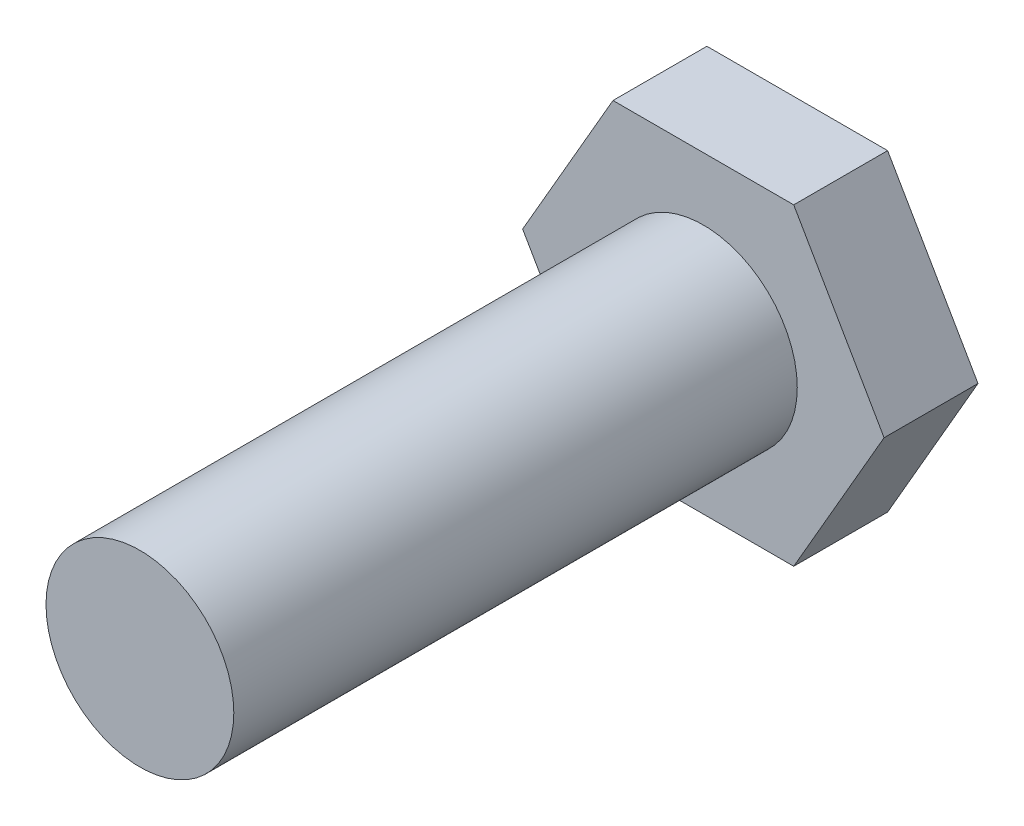
ISO-10303-21;
HEADER;
FILE_DESCRIPTION(('STEP AP214'),'2;1');
FILE_NAME('part.step','',(''),(''),'','','');
FILE_SCHEMA(('AUTOMOTIVE_DESIGN { 1 0 10303 214 1 1 1 1 }'));
ENDSEC;
DATA;
#1=APPLICATION_CONTEXT('core data for automotive mechanical design processes');
#2=APPLICATION_PROTOCOL_DEFINITION('international standard','automotive_design',2000,#1);
#3=PRODUCT_CONTEXT('',#1,'mechanical');
#4=PRODUCT('Part','Part','',(#3));
#5=PRODUCT_RELATED_PRODUCT_CATEGORY('part','',(#4));
#6=PRODUCT_DEFINITION_FORMATION('','',#4);
#7=PRODUCT_DEFINITION_CONTEXT('part definition',#1,'design');
#8=PRODUCT_DEFINITION('design','',#6,#7);
#9=PRODUCT_DEFINITION_SHAPE('','',#8);
#10=(LENGTH_UNIT() NAMED_UNIT(*) SI_UNIT(.MILLI.,.METRE.));
#11=(NAMED_UNIT(*) PLANE_ANGLE_UNIT() SI_UNIT($,.RADIAN.));
#12=(NAMED_UNIT(*) SI_UNIT($,.STERADIAN.) SOLID_ANGLE_UNIT());
#13=UNCERTAINTY_MEASURE_WITH_UNIT(LENGTH_MEASURE(1.E-05),#10,'distance_accuracy_value','');
#14=(GEOMETRIC_REPRESENTATION_CONTEXT(3) GLOBAL_UNCERTAINTY_ASSIGNED_CONTEXT((#13)) GLOBAL_UNIT_ASSIGNED_CONTEXT((#10,
#11,#12)) REPRESENTATION_CONTEXT('',''));
#15=CARTESIAN_POINT('',(0.,0.,0.));
#16=DIRECTION('',(0.,0.,1.));
#17=DIRECTION('',(1.,0.,0.));
#18=AXIS2_PLACEMENT_3D('',#15,#16,#17);
#19=CARTESIAN_POINT('',(0.,0.,1.5));
#20=DIRECTION('',(0.,0.,1.));
#21=DIRECTION('',(1.,0.,0.));
#22=AXIS2_PLACEMENT_3D('',#19,#20,#21);
#23=PLANE('',#22);
#24=DIRECTION('',(0.5,0.866025403784439,0.));
#25=VECTOR('',#24,1.);
#26=CARTESIAN_POINT('',(1.44337567297407,-2.5,1.5));
#27=LINE('',#26,#25);
#28=CARTESIAN_POINT('',(1.44337567297407,-2.5,1.5));
#29=VERTEX_POINT('',#28);
#30=CARTESIAN_POINT('',(2.88675134594813,0.,1.5));
#31=VERTEX_POINT('',#30);
#32=EDGE_CURVE('E128',#29,#31,#27,.T.);
#33=ORIENTED_EDGE('',*,*,#32,.T.);
#34=DIRECTION('',(-0.5,0.866025403784438,0.));
#35=VECTOR('',#34,1.);
#36=CARTESIAN_POINT('',(2.88675134594813,0.,1.5));
#37=LINE('',#36,#35);
#38=CARTESIAN_POINT('',(1.44337567297406,2.5,1.5));
#39=VERTEX_POINT('',#38);
#40=EDGE_CURVE('E86',#31,#39,#37,.T.);
#41=ORIENTED_EDGE('',*,*,#40,.T.);
#42=DIRECTION('',(-1.,0.,0.));
#43=VECTOR('',#42,1.);
#44=CARTESIAN_POINT('',(1.44337567297406,2.5,1.5));
#45=LINE('',#44,#43);
#46=CARTESIAN_POINT('',(-1.44337567297407,2.5,1.5));
#47=VERTEX_POINT('',#46);
#48=EDGE_CURVE('E99',#39,#47,#45,.T.);
#49=ORIENTED_EDGE('',*,*,#48,.T.);
#50=DIRECTION('',(-0.499999999999999,-0.866025403784439,0.));
#51=VECTOR('',#50,1.);
#52=CARTESIAN_POINT('',(-1.44337567297407,2.5,1.5));
#53=LINE('',#52,#51);
#54=CARTESIAN_POINT('',(-2.88675134594813,0.,1.5));
#55=VERTEX_POINT('',#54);
#56=EDGE_CURVE('E93',#47,#55,#53,.T.);
#57=ORIENTED_EDGE('',*,*,#56,.T.);
#58=DIRECTION('',(0.5,-0.866025403784439,0.));
#59=VECTOR('',#58,1.);
#60=CARTESIAN_POINT('',(-2.88675134594813,0.,1.5));
#61=LINE('',#60,#59);
#62=CARTESIAN_POINT('',(-1.44337567297406,-2.5,1.5));
#63=VERTEX_POINT('',#62);
#64=EDGE_CURVE('E97',#55,#63,#61,.T.);
#65=ORIENTED_EDGE('',*,*,#64,.T.);
#66=DIRECTION('',(1.,0.,0.));
#67=VECTOR('',#66,1.);
#68=CARTESIAN_POINT('',(-1.44337567297406,-2.5,1.5));
#69=LINE('',#68,#67);
#70=EDGE_CURVE('E49',#63,#29,#69,.T.);
#71=ORIENTED_EDGE('',*,*,#70,.T.);
#72=EDGE_LOOP('',(#33,#41,#49,#57,#65,#71));
#73=FACE_BOUND('',#72,.T.);
#74=CARTESIAN_POINT('',(0.,0.,1.5));
#75=DIRECTION('',(0.,0.,1.));
#76=DIRECTION('',(1.,0.,0.));
#77=AXIS2_PLACEMENT_3D('',#74,#75,#76);
#78=CIRCLE('',#77,1.5);
#79=CARTESIAN_POINT('',(1.5,0.,1.5));
#80=VERTEX_POINT('',#79);
#81=EDGE_CURVE('E168',#80,#80,#78,.T.);
#82=ORIENTED_EDGE('',*,*,#81,.F.);
#83=EDGE_LOOP('',(#82));
#84=FACE_BOUND('',#83,.T.);
#85=ADVANCED_FACE('F32',(#73,#84),#23,.T.);
#86=CARTESIAN_POINT('',(1.44337567297407,-2.5,1.5));
#87=DIRECTION('',(-0.866025403784439,0.5,0.));
#88=DIRECTION('',(-0.5,-0.866025403784439,0.));
#89=AXIS2_PLACEMENT_3D('',#86,#87,#88);
#90=PLANE('',#89);
#91=DIRECTION('',(0.5,0.866025403784439,0.));
#92=VECTOR('',#91,1.);
#93=CARTESIAN_POINT('',(1.44337567297407,-2.5,0.));
#94=LINE('',#93,#92);
#95=CARTESIAN_POINT('',(1.44337567297407,-2.5,0.));
#96=VERTEX_POINT('',#95);
#97=CARTESIAN_POINT('',(2.88675134594813,0.,0.));
#98=VERTEX_POINT('',#97);
#99=EDGE_CURVE('E117',#96,#98,#94,.T.);
#100=ORIENTED_EDGE('',*,*,#99,.T.);
#101=DIRECTION('',(0.,0.,-1.));
#102=VECTOR('',#101,1.);
#103=CARTESIAN_POINT('',(2.88675134594813,0.,1.5));
#104=LINE('',#103,#102);
#105=EDGE_CURVE('E11',#31,#98,#104,.T.);
#106=ORIENTED_EDGE('',*,*,#105,.F.);
#107=ORIENTED_EDGE('',*,*,#32,.F.);
#108=DIRECTION('',(0.,0.,-1.));
#109=VECTOR('',#108,1.);
#110=CARTESIAN_POINT('',(1.44337567297407,-2.5,1.5));
#111=LINE('',#110,#109);
#112=EDGE_CURVE('E113',#29,#96,#111,.T.);
#113=ORIENTED_EDGE('',*,*,#112,.T.);
#114=EDGE_LOOP('',(#100,#106,#107,#113));
#115=FACE_BOUND('',#114,.T.);
#116=ADVANCED_FACE('F34',(#115),#90,.F.);
#117=CARTESIAN_POINT('',(2.88675134594813,0.,1.5));
#118=DIRECTION('',(-0.866025403784438,-0.5,0.));
#119=DIRECTION('',(0.5,-0.866025403784438,0.));
#120=AXIS2_PLACEMENT_3D('',#117,#118,#119);
#121=PLANE('',#120);
#122=DIRECTION('',(-0.5,0.866025403784438,0.));
#123=VECTOR('',#122,1.);
#124=CARTESIAN_POINT('',(2.88675134594813,0.,0.));
#125=LINE('',#124,#123);
#126=CARTESIAN_POINT('',(1.44337567297406,2.5,0.));
#127=VERTEX_POINT('',#126);
#128=EDGE_CURVE('E120',#98,#127,#125,.T.);
#129=ORIENTED_EDGE('',*,*,#128,.T.);
#130=DIRECTION('',(0.,0.,-1.));
#131=VECTOR('',#130,1.);
#132=CARTESIAN_POINT('',(1.44337567297406,2.5,1.5));
#133=LINE('',#132,#131);
#134=EDGE_CURVE('E41',#39,#127,#133,.T.);
#135=ORIENTED_EDGE('',*,*,#134,.F.);
#136=ORIENTED_EDGE('',*,*,#40,.F.);
#137=ORIENTED_EDGE('',*,*,#105,.T.);
#138=EDGE_LOOP('',(#129,#135,#136,#137));
#139=FACE_BOUND('',#138,.T.);
#140=ADVANCED_FACE('F156',(#139),#121,.F.);
#141=CARTESIAN_POINT('',(1.44337567297406,2.5,1.5));
#142=DIRECTION('',(0.,-1.,0.));
#143=DIRECTION('',(1.,0.,0.));
#144=AXIS2_PLACEMENT_3D('',#141,#142,#143);
#145=PLANE('',#144);
#146=DIRECTION('',(-1.,0.,0.));
#147=VECTOR('',#146,1.);
#148=CARTESIAN_POINT('',(1.44337567297406,2.5,0.));
#149=LINE('',#148,#147);
#150=CARTESIAN_POINT('',(-1.44337567297407,2.5,0.));
#151=VERTEX_POINT('',#150);
#152=EDGE_CURVE('E123',#127,#151,#149,.T.);
#153=ORIENTED_EDGE('',*,*,#152,.T.);
#154=DIRECTION('',(0.,0.,-1.));
#155=VECTOR('',#154,1.);
#156=CARTESIAN_POINT('',(-1.44337567297407,2.5,1.5));
#157=LINE('',#156,#155);
#158=EDGE_CURVE('E108',#47,#151,#157,.T.);
#159=ORIENTED_EDGE('',*,*,#158,.F.);
#160=ORIENTED_EDGE('',*,*,#48,.F.);
#161=ORIENTED_EDGE('',*,*,#134,.T.);
#162=EDGE_LOOP('',(#153,#159,#160,#161));
#163=FACE_BOUND('',#162,.T.);
#164=ADVANCED_FACE('F134',(#163),#145,.F.);
#165=CARTESIAN_POINT('',(-1.44337567297407,2.5,1.5));
#166=DIRECTION('',(0.866025403784439,-0.499999999999999,0.));
#167=DIRECTION('',(0.499999999999999,0.866025403784439,0.));
#168=AXIS2_PLACEMENT_3D('',#165,#166,#167);
#169=PLANE('',#168);
#170=DIRECTION('',(-0.499999999999999,-0.866025403784439,0.));
#171=VECTOR('',#170,1.);
#172=CARTESIAN_POINT('',(-1.44337567297407,2.5,0.));
#173=LINE('',#172,#171);
#174=CARTESIAN_POINT('',(-2.88675134594813,0.,0.));
#175=VERTEX_POINT('',#174);
#176=EDGE_CURVE('E107',#151,#175,#173,.T.);
#177=ORIENTED_EDGE('',*,*,#176,.T.);
#178=DIRECTION('',(0.,0.,-1.));
#179=VECTOR('',#178,1.);
#180=CARTESIAN_POINT('',(-2.88675134594813,0.,1.5));
#181=LINE('',#180,#179);
#182=EDGE_CURVE('E104',#55,#175,#181,.T.);
#183=ORIENTED_EDGE('',*,*,#182,.F.);
#184=ORIENTED_EDGE('',*,*,#56,.F.);
#185=ORIENTED_EDGE('',*,*,#158,.T.);
#186=EDGE_LOOP('',(#177,#183,#184,#185));
#187=FACE_BOUND('',#186,.T.);
#188=ADVANCED_FACE('F105',(#187),#169,.F.);
#189=CARTESIAN_POINT('',(-2.88675134594813,0.,1.5));
#190=DIRECTION('',(0.866025403784438,0.5,0.));
#191=DIRECTION('',(-0.5,0.866025403784439,0.));
#192=AXIS2_PLACEMENT_3D('',#189,#190,#191);
#193=PLANE('',#192);
#194=DIRECTION('',(0.5,-0.866025403784439,0.));
#195=VECTOR('',#194,1.);
#196=CARTESIAN_POINT('',(-2.88675134594813,0.,0.));
#197=LINE('',#196,#195);
#198=CARTESIAN_POINT('',(-1.44337567297406,-2.5,0.));
#199=VERTEX_POINT('',#198);
#200=EDGE_CURVE('E72',#175,#199,#197,.T.);
#201=ORIENTED_EDGE('',*,*,#200,.T.);
#202=DIRECTION('',(0.,0.,-1.));
#203=VECTOR('',#202,1.);
#204=CARTESIAN_POINT('',(-1.44337567297406,-2.5,1.5));
#205=LINE('',#204,#203);
#206=EDGE_CURVE('E109',#63,#199,#205,.T.);
#207=ORIENTED_EDGE('',*,*,#206,.F.);
#208=ORIENTED_EDGE('',*,*,#64,.F.);
#209=ORIENTED_EDGE('',*,*,#182,.T.);
#210=EDGE_LOOP('',(#201,#207,#208,#209));
#211=FACE_BOUND('',#210,.T.);
#212=ADVANCED_FACE('F111',(#211),#193,.F.);
#213=CARTESIAN_POINT('',(-1.44337567297406,-2.5,1.5));
#214=DIRECTION('',(0.,1.,0.));
#215=DIRECTION('',(-1.,0.,0.));
#216=AXIS2_PLACEMENT_3D('',#213,#214,#215);
#217=PLANE('',#216);
#218=DIRECTION('',(1.,0.,0.));
#219=VECTOR('',#218,1.);
#220=CARTESIAN_POINT('',(-1.44337567297406,-2.5,0.));
#221=LINE('',#220,#219);
#222=EDGE_CURVE('E78',#199,#96,#221,.T.);
#223=ORIENTED_EDGE('',*,*,#222,.T.);
#224=ORIENTED_EDGE('',*,*,#112,.F.);
#225=ORIENTED_EDGE('',*,*,#70,.F.);
#226=ORIENTED_EDGE('',*,*,#206,.T.);
#227=EDGE_LOOP('',(#223,#224,#225,#226));
#228=FACE_BOUND('',#227,.T.);
#229=ADVANCED_FACE('F141',(#228),#217,.F.);
#230=CARTESIAN_POINT('',(0.,0.,0.));
#231=DIRECTION('',(0.,0.,1.));
#232=DIRECTION('',(1.,0.,0.));
#233=AXIS2_PLACEMENT_3D('',#230,#231,#232);
#234=PLANE('',#233);
#235=ORIENTED_EDGE('',*,*,#99,.F.);
#236=ORIENTED_EDGE('',*,*,#222,.F.);
#237=ORIENTED_EDGE('',*,*,#200,.F.);
#238=ORIENTED_EDGE('',*,*,#176,.F.);
#239=ORIENTED_EDGE('',*,*,#152,.F.);
#240=ORIENTED_EDGE('',*,*,#128,.F.);
#241=EDGE_LOOP('',(#235,#236,#237,#238,#239,#240));
#242=FACE_BOUND('',#241,.T.);
#243=ADVANCED_FACE('F137',(#242),#234,.F.);
#244=CARTESIAN_POINT('',(0.,0.,10.5));
#245=DIRECTION('',(0.,0.,-1.));
#246=DIRECTION('',(-1.,0.,0.));
#247=AXIS2_PLACEMENT_3D('',#244,#245,#246);
#248=CYLINDRICAL_SURFACE('',#247,1.5);
#249=CARTESIAN_POINT('',(0.,0.,10.5));
#250=DIRECTION('',(0.,0.,1.));
#251=DIRECTION('',(1.,0.,0.));
#252=AXIS2_PLACEMENT_3D('',#249,#250,#251);
#253=CIRCLE('',#252,1.5);
#254=CARTESIAN_POINT('',(1.5,0.,10.5));
#255=VERTEX_POINT('',#254);
#256=EDGE_CURVE('E121',#255,#255,#253,.T.);
#257=ORIENTED_EDGE('',*,*,#256,.F.);
#258=EDGE_LOOP('',(#257));
#259=FACE_BOUND('',#258,.T.);
#260=ORIENTED_EDGE('',*,*,#81,.T.);
#261=EDGE_LOOP('',(#260));
#262=FACE_BOUND('',#261,.T.);
#263=ADVANCED_FACE('F148',(#259,#262),#248,.T.);
#264=CARTESIAN_POINT('',(0.,0.,10.5));
#265=DIRECTION('',(0.,0.,1.));
#266=DIRECTION('',(1.,0.,0.));
#267=AXIS2_PLACEMENT_3D('',#264,#265,#266);
#268=PLANE('',#267);
#269=ORIENTED_EDGE('',*,*,#256,.T.);
#270=EDGE_LOOP('',(#269));
#271=FACE_BOUND('',#270,.T.);
#272=ADVANCED_FACE('F160',(#271),#268,.T.);
#273=CLOSED_SHELL('',(#85,#116,#140,#164,#188,#212,#229,#243,#263,#272));
#274=MANIFOLD_SOLID_BREP('B2',#273);
#275=ADVANCED_BREP_SHAPE_REPRESENTATION('',(#18,#274),#14);
#276=SHAPE_DEFINITION_REPRESENTATION(#9,#275);
ENDSEC;
END-ISO-10303-21;
